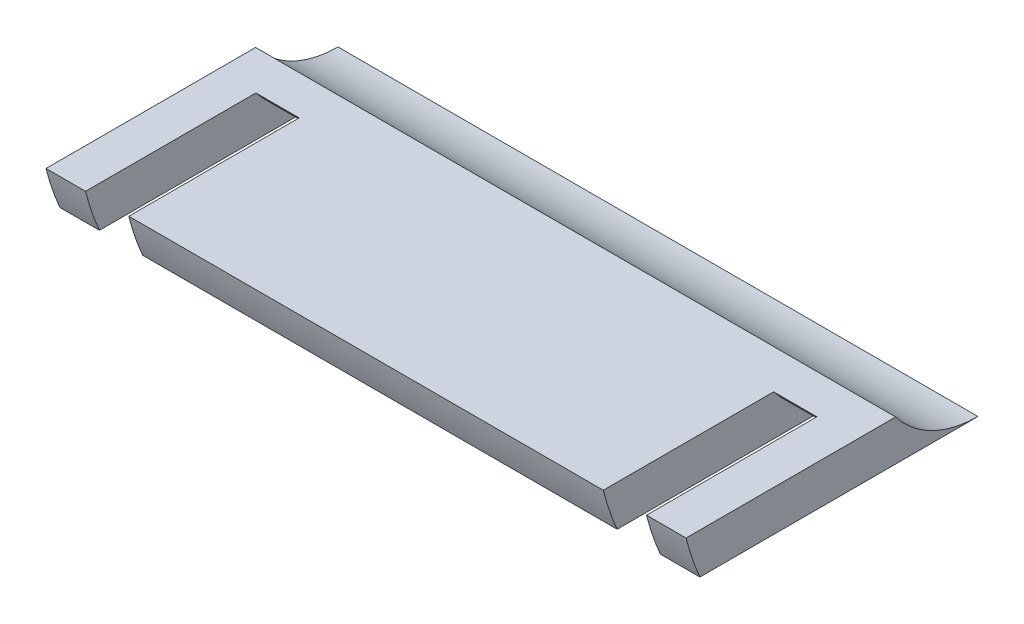
ISO-10303-21;
HEADER;
FILE_DESCRIPTION(('STEP AP214'),'2;1');
FILE_NAME('part.step','',(''),(''),'','','');
FILE_SCHEMA(('AUTOMOTIVE_DESIGN { 1 0 10303 214 1 1 1 1 }'));
ENDSEC;
DATA;
#1=APPLICATION_CONTEXT('core data for automotive mechanical design processes');
#2=APPLICATION_PROTOCOL_DEFINITION('international standard','automotive_design',2000,#1);
#3=PRODUCT_CONTEXT('',#1,'mechanical');
#4=PRODUCT('Part','Part','',(#3));
#5=PRODUCT_RELATED_PRODUCT_CATEGORY('part','',(#4));
#6=PRODUCT_DEFINITION_FORMATION('','',#4);
#7=PRODUCT_DEFINITION_CONTEXT('part definition',#1,'design');
#8=PRODUCT_DEFINITION('design','',#6,#7);
#9=PRODUCT_DEFINITION_SHAPE('','',#8);
#10=(LENGTH_UNIT() NAMED_UNIT(*) SI_UNIT(.MILLI.,.METRE.));
#11=(NAMED_UNIT(*) PLANE_ANGLE_UNIT() SI_UNIT($,.RADIAN.));
#12=(NAMED_UNIT(*) SI_UNIT($,.STERADIAN.) SOLID_ANGLE_UNIT());
#13=UNCERTAINTY_MEASURE_WITH_UNIT(LENGTH_MEASURE(1.E-05),#10,'distance_accuracy_value','');
#14=(GEOMETRIC_REPRESENTATION_CONTEXT(3) GLOBAL_UNCERTAINTY_ASSIGNED_CONTEXT((#13)) GLOBAL_UNIT_ASSIGNED_CONTEXT((#10,
#11,#12)) REPRESENTATION_CONTEXT('',''));
#15=CARTESIAN_POINT('',(0.,0.,0.));
#16=DIRECTION('',(0.,0.,1.));
#17=DIRECTION('',(1.,0.,0.));
#18=AXIS2_PLACEMENT_3D('',#15,#16,#17);
#19=CARTESIAN_POINT('',(-124.224609816464,12.7052364760712,4.25405505109214));
#20=DIRECTION('',(1.,0.,0.));
#21=DIRECTION('',(0.,0.,-1.));
#22=AXIS2_PLACEMENT_3D('',#19,#20,#21);
#23=CYLINDRICAL_SURFACE('',#22,12.5552364760711);
#24=DIRECTION('',(-1.,0.,0.));
#25=VECTOR('',#24,1.);
#26=CARTESIAN_POINT('',(44.2609089212692,0.150000000000107,4.25405505109206));
#27=LINE('',#26,#25);
#28=CARTESIAN_POINT('',(-29.1,0.150000000000115,4.25405505109208));
#29=VERTEX_POINT('',#28);
#30=CARTESIAN_POINT('',(-34.4,0.150000000000115,4.25405505109206));
#31=VERTEX_POINT('',#30);
#32=EDGE_CURVE('E58',#29,#31,#27,.T.);
#33=ORIENTED_EDGE('',*,*,#32,.F.);
#34=CARTESIAN_POINT('',(-29.1,12.7052364760712,4.25405505109208));
#35=DIRECTION('',(-1.,0.,0.));
#36=DIRECTION('',(0.,0.,1.));
#37=AXIS2_PLACEMENT_3D('',#34,#35,#36);
#38=CIRCLE('',#37,12.5552364760711);
#39=CARTESIAN_POINT('',(-29.1,5.,14.1668394136154));
#40=VERTEX_POINT('',#39);
#41=EDGE_CURVE('E214',#29,#40,#38,.T.);
#42=ORIENTED_EDGE('',*,*,#41,.T.);
#43=DIRECTION('',(1.,0.,0.));
#44=VECTOR('',#43,1.);
#45=CARTESIAN_POINT('',(-124.224609816464,5.,14.1668394136155));
#46=LINE('',#45,#44);
#47=CARTESIAN_POINT('',(-34.4,5.,14.1668394136154));
#48=VERTEX_POINT('',#47);
#49=EDGE_CURVE('E163',#40,#48,#46,.F.);
#50=ORIENTED_EDGE('',*,*,#49,.T.);
#51=CARTESIAN_POINT('',(-34.4,12.7052364760712,4.25405505109209));
#52=DIRECTION('',(-1.,0.,0.));
#53=DIRECTION('',(0.,0.,1.));
#54=AXIS2_PLACEMENT_3D('',#51,#52,#53);
#55=CIRCLE('',#54,12.5552364760711);
#56=EDGE_CURVE('E208',#31,#48,#55,.T.);
#57=ORIENTED_EDGE('',*,*,#56,.F.);
#58=EDGE_LOOP('',(#33,#42,#50,#57));
#59=FACE_BOUND('',#58,.T.);
#60=ADVANCED_FACE('F35',(#59),#23,.T.);
#61=CARTESIAN_POINT('',(-29.1,12.7052364760712,4.25405505109208));
#62=DIRECTION('',(-1.,0.,0.));
#63=DIRECTION('',(0.,0.,1.));
#64=AXIS2_PLACEMENT_3D('',#61,#62,#63);
#65=PLANE('',#64);
#66=ORIENTED_EDGE('',*,*,#41,.F.);
#67=DIRECTION('',(0.,-1.,0.));
#68=VECTOR('',#67,1.);
#69=CARTESIAN_POINT('',(-29.1,12.7052364760712,4.25405505109208));
#70=LINE('',#69,#68);
#71=CARTESIAN_POINT('',(-29.1,0.,4.25405505109206));
#72=VERTEX_POINT('',#71);
#73=EDGE_CURVE('E50',#29,#72,#70,.T.);
#74=ORIENTED_EDGE('',*,*,#73,.T.);
#75=DIRECTION('',(0.,0.,1.));
#76=VECTOR('',#75,1.);
#77=CARTESIAN_POINT('',(-29.1,0.,0.));
#78=LINE('',#77,#76);
#79=CARTESIAN_POINT('',(-29.1,0.,33.359630671102));
#80=VERTEX_POINT('',#79);
#81=EDGE_CURVE('E222',#72,#80,#78,.T.);
#82=ORIENTED_EDGE('',*,*,#81,.T.);
#83=CARTESIAN_POINT('',(-29.1,12.7052364760712,4.25405505109208));
#84=DIRECTION('',(-1.,0.,0.));
#85=DIRECTION('',(0.,0.,1.));
#86=AXIS2_PLACEMENT_3D('',#83,#84,#85);
#87=CIRCLE('',#86,31.7577953593288);
#88=CARTESIAN_POINT('',(-29.1,4.99999999999999,35.0629319688382));
#89=VERTEX_POINT('',#88);
#90=EDGE_CURVE('E213',#80,#89,#87,.T.);
#91=ORIENTED_EDGE('',*,*,#90,.T.);
#92=DIRECTION('',(0.,0.,1.));
#93=VECTOR('',#92,1.);
#94=CARTESIAN_POINT('',(-29.1,5.,0.));
#95=LINE('',#94,#93);
#96=EDGE_CURVE('E149',#40,#89,#95,.T.);
#97=ORIENTED_EDGE('',*,*,#96,.F.);
#98=EDGE_LOOP('',(#66,#74,#82,#91,#97));
#99=FACE_BOUND('',#98,.T.);
#100=ADVANCED_FACE('F250',(#99),#65,.T.);
#101=CARTESIAN_POINT('',(-34.4,5.,15.7582419347635));
#102=DIRECTION('',(-1.,0.,0.));
#103=DIRECTION('',(0.,0.,1.));
#104=AXIS2_PLACEMENT_3D('',#101,#102,#103);
#105=PLANE('',#104);
#106=DIRECTION('',(0.,-1.,0.));
#107=VECTOR('',#106,1.);
#108=CARTESIAN_POINT('',(-34.4,5.,4.25405505109206));
#109=LINE('',#108,#107);
#110=CARTESIAN_POINT('',(-34.4,0.,4.25405505109206));
#111=VERTEX_POINT('',#110);
#112=EDGE_CURVE('E248',#31,#111,#109,.T.);
#113=ORIENTED_EDGE('',*,*,#112,.F.);
#114=ORIENTED_EDGE('',*,*,#56,.T.);
#115=DIRECTION('',(0.,0.,1.));
#116=VECTOR('',#115,1.);
#117=CARTESIAN_POINT('',(-34.4,5.,0.));
#118=LINE('',#117,#116);
#119=CARTESIAN_POINT('',(-34.4000000000001,5.,35.0629319688381));
#120=VERTEX_POINT('',#119);
#121=EDGE_CURVE('E220',#48,#120,#118,.T.);
#122=ORIENTED_EDGE('',*,*,#121,.T.);
#123=CARTESIAN_POINT('',(-34.4,12.7052364760712,4.25405505109209));
#124=DIRECTION('',(-1.,0.,0.));
#125=DIRECTION('',(0.,0.,1.));
#126=AXIS2_PLACEMENT_3D('',#123,#124,#125);
#127=CIRCLE('',#126,31.7577953593288);
#128=CARTESIAN_POINT('',(-34.4000000000001,0.,33.359630671102));
#129=VERTEX_POINT('',#128);
#130=EDGE_CURVE('E209',#129,#120,#127,.T.);
#131=ORIENTED_EDGE('',*,*,#130,.F.);
#132=DIRECTION('',(0.,0.,1.));
#133=VECTOR('',#132,1.);
#134=CARTESIAN_POINT('',(-34.4,0.,0.));
#135=LINE('',#134,#133);
#136=EDGE_CURVE('E212',#111,#129,#135,.T.);
#137=ORIENTED_EDGE('',*,*,#136,.F.);
#138=EDGE_LOOP('',(#113,#114,#122,#131,#137));
#139=FACE_BOUND('',#138,.T.);
#140=ADVANCED_FACE('F246',(#139),#105,.F.);
#141=CARTESIAN_POINT('',(-60.7246098164642,12.7052364760712,4.2540550510921));
#142=DIRECTION('',(1.,0.,0.));
#143=DIRECTION('',(0.,0.,-1.));
#144=AXIS2_PLACEMENT_3D('',#141,#142,#143);
#145=CYLINDRICAL_SURFACE('',#144,12.5552364760711);
#146=CARTESIAN_POINT('',(29.1,12.7052364760712,4.25405505109205));
#147=DIRECTION('',(-1.,0.,0.));
#148=DIRECTION('',(0.,0.,1.));
#149=AXIS2_PLACEMENT_3D('',#146,#147,#148);
#150=CIRCLE('',#149,12.5552364760711);
#151=CARTESIAN_POINT('',(29.1,5.,14.1668394136154));
#152=VERTEX_POINT('',#151);
#153=CARTESIAN_POINT('',(29.1,0.150000000000115,4.2540550510921));
#154=VERTEX_POINT('',#153);
#155=EDGE_CURVE('E185',#152,#154,#150,.F.);
#156=ORIENTED_EDGE('',*,*,#155,.T.);
#157=CARTESIAN_POINT('',(34.4,0.150000000000115,4.25405505109204));
#158=VERTEX_POINT('',#157);
#159=EDGE_CURVE('E262',#158,#154,#27,.T.);
#160=ORIENTED_EDGE('',*,*,#159,.F.);
#161=CARTESIAN_POINT('',(34.4,12.7052364760712,4.25405505109204));
#162=DIRECTION('',(1.,0.,0.));
#163=DIRECTION('',(0.,0.,-1.));
#164=AXIS2_PLACEMENT_3D('',#161,#162,#163);
#165=CIRCLE('',#164,12.5552364760711);
#166=CARTESIAN_POINT('',(34.4,5.,14.1668394136154));
#167=VERTEX_POINT('',#166);
#168=EDGE_CURVE('E188',#167,#158,#165,.T.);
#169=ORIENTED_EDGE('',*,*,#168,.F.);
#170=DIRECTION('',(1.,0.,0.));
#171=VECTOR('',#170,1.);
#172=CARTESIAN_POINT('',(-60.7246098164642,5.,14.1668394136154));
#173=LINE('',#172,#171);
#174=EDGE_CURVE('E43',#152,#167,#173,.T.);
#175=ORIENTED_EDGE('',*,*,#174,.F.);
#176=EDGE_LOOP('',(#156,#160,#169,#175));
#177=FACE_BOUND('',#176,.T.);
#178=ADVANCED_FACE('F184',(#177),#145,.T.);
#179=CARTESIAN_POINT('',(34.4,12.7052364760712,4.25405505109204));
#180=DIRECTION('',(1.,0.,0.));
#181=DIRECTION('',(0.,0.,-1.));
#182=AXIS2_PLACEMENT_3D('',#179,#180,#181);
#183=PLANE('',#182);
#184=DIRECTION('',(0.,1.,0.));
#185=VECTOR('',#184,1.);
#186=CARTESIAN_POINT('',(34.4,12.7052364760712,4.25405505109204));
#187=LINE('',#186,#185);
#188=CARTESIAN_POINT('',(34.4,0.,4.25405505109206));
#189=VERTEX_POINT('',#188);
#190=EDGE_CURVE('E257',#189,#158,#187,.T.);
#191=ORIENTED_EDGE('',*,*,#190,.F.);
#192=DIRECTION('',(0.,0.,-1.));
#193=VECTOR('',#192,1.);
#194=CARTESIAN_POINT('',(34.4,0.,0.));
#195=LINE('',#194,#193);
#196=CARTESIAN_POINT('',(34.4,0.,33.359630671102));
#197=VERTEX_POINT('',#196);
#198=EDGE_CURVE('E204',#197,#189,#195,.T.);
#199=ORIENTED_EDGE('',*,*,#198,.F.);
#200=CARTESIAN_POINT('',(34.4,12.7052364760712,4.25405505109204));
#201=DIRECTION('',(1.,0.,0.));
#202=DIRECTION('',(0.,0.,-1.));
#203=AXIS2_PLACEMENT_3D('',#200,#201,#202);
#204=CIRCLE('',#203,31.7577953593288);
#205=CARTESIAN_POINT('',(34.4,5.00000000000001,35.0629319688381));
#206=VERTEX_POINT('',#205);
#207=EDGE_CURVE('E194',#206,#197,#204,.T.);
#208=ORIENTED_EDGE('',*,*,#207,.F.);
#209=DIRECTION('',(0.,0.,-1.));
#210=VECTOR('',#209,1.);
#211=CARTESIAN_POINT('',(34.4,5.,0.));
#212=LINE('',#211,#210);
#213=EDGE_CURVE('E176',#206,#167,#212,.T.);
#214=ORIENTED_EDGE('',*,*,#213,.T.);
#215=ORIENTED_EDGE('',*,*,#168,.T.);
#216=EDGE_LOOP('',(#191,#199,#208,#214,#215));
#217=FACE_BOUND('',#216,.T.);
#218=ADVANCED_FACE('F275',(#217),#183,.F.);
#219=CARTESIAN_POINT('',(29.1,5.,4.2540550510921));
#220=DIRECTION('',(-1.,0.,0.));
#221=DIRECTION('',(0.,0.,1.));
#222=AXIS2_PLACEMENT_3D('',#219,#220,#221);
#223=PLANE('',#222);
#224=DIRECTION('',(0.,-1.,0.));
#225=VECTOR('',#224,1.);
#226=CARTESIAN_POINT('',(29.1,5.,4.2540550510921));
#227=LINE('',#226,#225);
#228=CARTESIAN_POINT('',(29.1,0.,4.25405505109206));
#229=VERTEX_POINT('',#228);
#230=EDGE_CURVE('E11',#154,#229,#227,.T.);
#231=ORIENTED_EDGE('',*,*,#230,.F.);
#232=ORIENTED_EDGE('',*,*,#155,.F.);
#233=DIRECTION('',(0.,0.,1.));
#234=VECTOR('',#233,1.);
#235=CARTESIAN_POINT('',(29.1,5.,0.));
#236=LINE('',#235,#234);
#237=CARTESIAN_POINT('',(29.1,5.,35.0629319688381));
#238=VERTEX_POINT('',#237);
#239=EDGE_CURVE('E179',#152,#238,#236,.T.);
#240=ORIENTED_EDGE('',*,*,#239,.T.);
#241=CARTESIAN_POINT('',(29.1,12.7052364760712,4.25405505109205));
#242=DIRECTION('',(-1.,0.,0.));
#243=DIRECTION('',(0.,0.,1.));
#244=AXIS2_PLACEMENT_3D('',#241,#242,#243);
#245=CIRCLE('',#244,31.7577953593288);
#246=CARTESIAN_POINT('',(29.1,0.,33.359630671102));
#247=VERTEX_POINT('',#246);
#248=EDGE_CURVE('E200',#238,#247,#245,.F.);
#249=ORIENTED_EDGE('',*,*,#248,.T.);
#250=DIRECTION('',(0.,0.,1.));
#251=VECTOR('',#250,1.);
#252=CARTESIAN_POINT('',(29.1,0.,0.));
#253=LINE('',#252,#251);
#254=EDGE_CURVE('E193',#229,#247,#253,.T.);
#255=ORIENTED_EDGE('',*,*,#254,.F.);
#256=EDGE_LOOP('',(#231,#232,#240,#249,#255));
#257=FACE_BOUND('',#256,.T.);
#258=ADVANCED_FACE('F190',(#257),#223,.F.);
#259=CARTESIAN_POINT('',(75.4062673143992,12.7052364760712,4.25405505109206));
#260=DIRECTION('',(-1.,0.,0.));
#261=DIRECTION('',(0.,0.,1.));
#262=AXIS2_PLACEMENT_3D('',#259,#260,#261);
#263=CYLINDRICAL_SURFACE('',#262,31.7577953593288);
#264=DIRECTION('',(-1.,0.,0.));
#265=VECTOR('',#264,1.);
#266=CARTESIAN_POINT('',(75.4062673143992,5.,35.0629319688381));
#267=LINE('',#266,#265);
#268=CARTESIAN_POINT('',(39.25,5.,35.0629319688381));
#269=VERTEX_POINT('',#268);
#270=EDGE_CURVE('E229',#269,#206,#267,.T.);
#271=ORIENTED_EDGE('',*,*,#270,.T.);
#272=ORIENTED_EDGE('',*,*,#207,.T.);
#273=DIRECTION('',(-1.,0.,0.));
#274=VECTOR('',#273,1.);
#275=CARTESIAN_POINT('',(75.4062673143992,0.,33.359630671102));
#276=LINE('',#275,#274);
#277=CARTESIAN_POINT('',(39.25,0.,33.359630671102));
#278=VERTEX_POINT('',#277);
#279=EDGE_CURVE('E233',#278,#197,#276,.T.);
#280=ORIENTED_EDGE('',*,*,#279,.F.);
#281=CARTESIAN_POINT('',(39.25,12.7052364760712,4.25405505109206));
#282=DIRECTION('',(-1.,0.,0.));
#283=DIRECTION('',(0.,0.,1.));
#284=AXIS2_PLACEMENT_3D('',#281,#282,#283);
#285=CIRCLE('',#284,31.7577953593288);
#286=EDGE_CURVE('E227',#278,#269,#285,.T.);
#287=ORIENTED_EDGE('',*,*,#286,.T.);
#288=EDGE_LOOP('',(#271,#272,#280,#287));
#289=FACE_BOUND('',#288,.T.);
#290=ADVANCED_FACE('F277',(#289),#263,.T.);
#291=CARTESIAN_POINT('',(0.,5.,0.));
#292=DIRECTION('',(0.,1.,0.));
#293=DIRECTION('',(0.,0.,1.));
#294=AXIS2_PLACEMENT_3D('',#291,#292,#293);
#295=PLANE('',#294);
#296=DIRECTION('',(-1.,0.,0.));
#297=VECTOR('',#296,1.);
#298=CARTESIAN_POINT('',(75.4062673143992,5.,9.35615209877028));
#299=LINE('',#298,#297);
#300=CARTESIAN_POINT('',(39.25,5.,9.35615209877028));
#301=VERTEX_POINT('',#300);
#302=CARTESIAN_POINT('',(-39.25,5.,9.35615209877028));
#303=VERTEX_POINT('',#302);
#304=EDGE_CURVE('E141',#301,#303,#299,.T.);
#305=ORIENTED_EDGE('',*,*,#304,.T.);
#306=DIRECTION('',(0.,0.,1.));
#307=VECTOR('',#306,1.);
#308=CARTESIAN_POINT('',(-39.25,5.,0.));
#309=LINE('',#308,#307);
#310=CARTESIAN_POINT('',(-39.25,5.,35.0629319688381));
#311=VERTEX_POINT('',#310);
#312=EDGE_CURVE('E154',#303,#311,#309,.T.);
#313=ORIENTED_EDGE('',*,*,#312,.T.);
#314=EDGE_CURVE('E235',#120,#311,#267,.T.);
#315=ORIENTED_EDGE('',*,*,#314,.F.);
#316=ORIENTED_EDGE('',*,*,#121,.F.);
#317=ORIENTED_EDGE('',*,*,#49,.F.);
#318=ORIENTED_EDGE('',*,*,#96,.T.);
#319=EDGE_CURVE('E237',#238,#89,#267,.T.);
#320=ORIENTED_EDGE('',*,*,#319,.F.);
#321=ORIENTED_EDGE('',*,*,#239,.F.);
#322=ORIENTED_EDGE('',*,*,#174,.T.);
#323=ORIENTED_EDGE('',*,*,#213,.F.);
#324=ORIENTED_EDGE('',*,*,#270,.F.);
#325=DIRECTION('',(0.,0.,-1.));
#326=VECTOR('',#325,1.);
#327=CARTESIAN_POINT('',(39.25,5.,0.));
#328=LINE('',#327,#326);
#329=EDGE_CURVE('E157',#269,#301,#328,.T.);
#330=ORIENTED_EDGE('',*,*,#329,.T.);
#331=EDGE_LOOP('',(#305,#313,#315,#316,#317,#318,#320,#321,#322,#323,#324,#330));
#332=FACE_BOUND('',#331,.T.);
#333=ADVANCED_FACE('F152',(#332),#295,.T.);
#334=EDGE_CURVE('E236',#247,#80,#276,.T.);
#335=ORIENTED_EDGE('',*,*,#334,.F.);
#336=ORIENTED_EDGE('',*,*,#248,.F.);
#337=ORIENTED_EDGE('',*,*,#319,.T.);
#338=ORIENTED_EDGE('',*,*,#90,.F.);
#339=EDGE_LOOP('',(#335,#336,#337,#338));
#340=FACE_BOUND('',#339,.T.);
#341=ADVANCED_FACE('F254',(#340),#263,.T.);
#342=CARTESIAN_POINT('',(-39.25,5.,0.));
#343=DIRECTION('',(1.,0.,0.));
#344=DIRECTION('',(0.,0.,-1.));
#345=AXIS2_PLACEMENT_3D('',#342,#343,#344);
#346=PLANE('',#345);
#347=ORIENTED_EDGE('',*,*,#312,.F.);
#348=CARTESIAN_POINT('',(-39.25,12.7052364760712,-0.745944948907936));
#349=DIRECTION('',(1.,0.,0.));
#350=DIRECTION('',(0.,0.,-1.));
#351=AXIS2_PLACEMENT_3D('',#348,#349,#350);
#352=CIRCLE('',#351,12.7052364760711);
#353=CARTESIAN_POINT('',(-39.25,0.,-0.745944948907936));
#354=VERTEX_POINT('',#353);
#355=EDGE_CURVE('E137',#354,#303,#352,.F.);
#356=ORIENTED_EDGE('',*,*,#355,.F.);
#357=DIRECTION('',(0.,0.,1.));
#358=VECTOR('',#357,1.);
#359=CARTESIAN_POINT('',(-39.25,0.,0.));
#360=LINE('',#359,#358);
#361=CARTESIAN_POINT('',(-39.25,0.,33.359630671102));
#362=VERTEX_POINT('',#361);
#363=EDGE_CURVE('E165',#354,#362,#360,.T.);
#364=ORIENTED_EDGE('',*,*,#363,.T.);
#365=CARTESIAN_POINT('',(-39.25,12.7052364760712,4.25405505109206));
#366=DIRECTION('',(1.,0.,0.));
#367=DIRECTION('',(0.,0.,-1.));
#368=AXIS2_PLACEMENT_3D('',#365,#366,#367);
#369=CIRCLE('',#368,31.7577953593288);
#370=EDGE_CURVE('E148',#362,#311,#369,.F.);
#371=ORIENTED_EDGE('',*,*,#370,.T.);
#372=EDGE_LOOP('',(#347,#356,#364,#371));
#373=FACE_BOUND('',#372,.T.);
#374=ADVANCED_FACE('F37',(#373),#346,.F.);
#375=CARTESIAN_POINT('',(39.25,5.,0.));
#376=DIRECTION('',(-1.,0.,0.));
#377=DIRECTION('',(0.,0.,1.));
#378=AXIS2_PLACEMENT_3D('',#375,#376,#377);
#379=PLANE('',#378);
#380=CARTESIAN_POINT('',(39.25,12.7052364760712,-0.745944948907936));
#381=DIRECTION('',(-1.,0.,0.));
#382=DIRECTION('',(0.,0.,1.));
#383=AXIS2_PLACEMENT_3D('',#380,#381,#382);
#384=CIRCLE('',#383,12.7052364760711);
#385=CARTESIAN_POINT('',(39.25,1.05818132034585E-13,-0.745944948907936));
#386=VERTEX_POINT('',#385);
#387=EDGE_CURVE('E168',#386,#301,#384,.T.);
#388=ORIENTED_EDGE('',*,*,#387,.T.);
#389=ORIENTED_EDGE('',*,*,#329,.F.);
#390=ORIENTED_EDGE('',*,*,#286,.F.);
#391=DIRECTION('',(0.,0.,-1.));
#392=VECTOR('',#391,1.);
#393=CARTESIAN_POINT('',(39.25,0.,0.));
#394=LINE('',#393,#392);
#395=EDGE_CURVE('E161',#278,#386,#394,.T.);
#396=ORIENTED_EDGE('',*,*,#395,.T.);
#397=EDGE_LOOP('',(#388,#389,#390,#396));
#398=FACE_BOUND('',#397,.T.);
#399=ADVANCED_FACE('F280',(#398),#379,.F.);
#400=CARTESIAN_POINT('',(0.,0.,0.));
#401=DIRECTION('',(0.,1.,0.));
#402=DIRECTION('',(0.,0.,1.));
#403=AXIS2_PLACEMENT_3D('',#400,#401,#402);
#404=PLANE('',#403);
#405=ORIENTED_EDGE('',*,*,#363,.F.);
#406=DIRECTION('',(-1.,0.,0.));
#407=VECTOR('',#406,1.);
#408=CARTESIAN_POINT('',(75.4062673143992,1.05818132034585E-13,-0.745944948907936));
#409=LINE('',#408,#407);
#410=EDGE_CURVE('E144',#386,#354,#409,.T.);
#411=ORIENTED_EDGE('',*,*,#410,.F.);
#412=ORIENTED_EDGE('',*,*,#395,.F.);
#413=ORIENTED_EDGE('',*,*,#279,.T.);
#414=ORIENTED_EDGE('',*,*,#198,.T.);
#415=DIRECTION('',(-1.,0.,0.));
#416=VECTOR('',#415,1.);
#417=CARTESIAN_POINT('',(44.2609089212692,0.,4.25405505109206));
#418=LINE('',#417,#416);
#419=EDGE_CURVE('E264',#189,#229,#418,.T.);
#420=ORIENTED_EDGE('',*,*,#419,.T.);
#421=ORIENTED_EDGE('',*,*,#254,.T.);
#422=ORIENTED_EDGE('',*,*,#334,.T.);
#423=ORIENTED_EDGE('',*,*,#81,.F.);
#424=EDGE_CURVE('E265',#72,#111,#418,.T.);
#425=ORIENTED_EDGE('',*,*,#424,.T.);
#426=ORIENTED_EDGE('',*,*,#136,.T.);
#427=EDGE_CURVE('E232',#129,#362,#276,.T.);
#428=ORIENTED_EDGE('',*,*,#427,.T.);
#429=EDGE_LOOP('',(#405,#411,#412,#413,#414,#420,#421,#422,#423,#425,#426,#428));
#430=FACE_BOUND('',#429,.T.);
#431=ADVANCED_FACE('F271',(#430),#404,.F.);
#432=CARTESIAN_POINT('',(75.4062673143992,12.7052364760712,-0.745944948907936));
#433=DIRECTION('',(-1.,0.,0.));
#434=DIRECTION('',(0.,0.,1.));
#435=AXIS2_PLACEMENT_3D('',#432,#433,#434);
#436=CYLINDRICAL_SURFACE('',#435,12.7052364760711);
#437=ORIENTED_EDGE('',*,*,#304,.F.);
#438=ORIENTED_EDGE('',*,*,#387,.F.);
#439=ORIENTED_EDGE('',*,*,#410,.T.);
#440=ORIENTED_EDGE('',*,*,#355,.T.);
#441=EDGE_LOOP('',(#437,#438,#439,#440));
#442=FACE_BOUND('',#441,.T.);
#443=ADVANCED_FACE('F139',(#442),#436,.F.);
#444=ORIENTED_EDGE('',*,*,#427,.F.);
#445=ORIENTED_EDGE('',*,*,#130,.T.);
#446=ORIENTED_EDGE('',*,*,#314,.T.);
#447=ORIENTED_EDGE('',*,*,#370,.F.);
#448=EDGE_LOOP('',(#444,#445,#446,#447));
#449=FACE_BOUND('',#448,.T.);
#450=ADVANCED_FACE('F241',(#449),#263,.T.);
#451=CARTESIAN_POINT('',(44.2609089212692,0.,4.25405505109206));
#452=DIRECTION('',(0.,0.,-1.));
#453=DIRECTION('',(-1.,0.,0.));
#454=AXIS2_PLACEMENT_3D('',#451,#452,#453);
#455=PLANE('',#454);
#456=ORIENTED_EDGE('',*,*,#419,.F.);
#457=ORIENTED_EDGE('',*,*,#190,.T.);
#458=ORIENTED_EDGE('',*,*,#159,.T.);
#459=ORIENTED_EDGE('',*,*,#230,.T.);
#460=EDGE_LOOP('',(#456,#457,#458,#459));
#461=FACE_BOUND('',#460,.T.);
#462=ADVANCED_FACE('F273',(#461),#455,.F.);
#463=ORIENTED_EDGE('',*,*,#73,.F.);
#464=ORIENTED_EDGE('',*,*,#32,.T.);
#465=ORIENTED_EDGE('',*,*,#112,.T.);
#466=ORIENTED_EDGE('',*,*,#424,.F.);
#467=EDGE_LOOP('',(#463,#464,#465,#466));
#468=FACE_BOUND('',#467,.T.);
#469=ADVANCED_FACE('F315',(#468),#455,.F.);
#470=CLOSED_SHELL('',(#60,#100,#140,#178,#218,#258,#290,#333,#341,#374,#399,#431,#443,#450,#462,#469));
#471=MANIFOLD_SOLID_BREP('B2',#470);
#472=ADVANCED_BREP_SHAPE_REPRESENTATION('',(#18,#471),#14);
#473=SHAPE_DEFINITION_REPRESENTATION(#9,#472);
ENDSEC;
END-ISO-10303-21;
